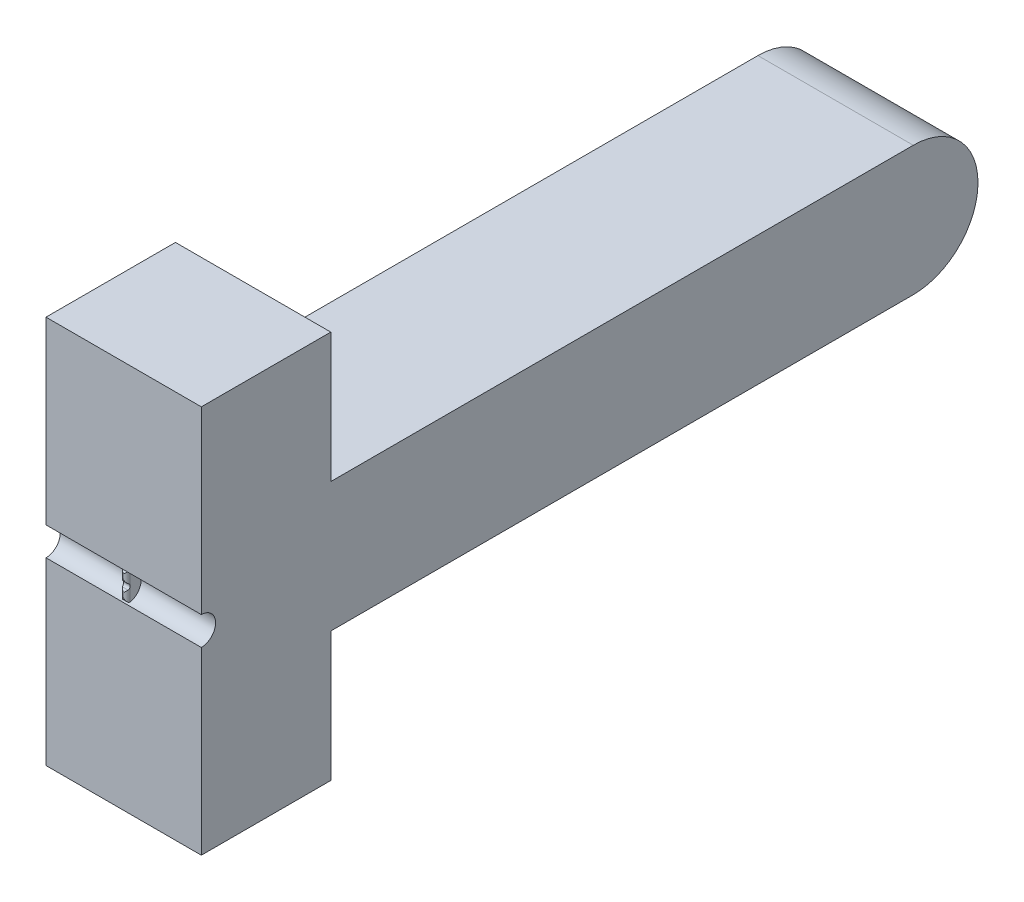
ISO-10303-21;
HEADER;
FILE_DESCRIPTION(('STEP AP214'),'2;1');
FILE_NAME('part.step','',(''),(''),'','','');
FILE_SCHEMA(('AUTOMOTIVE_DESIGN { 1 0 10303 214 1 1 1 1 }'));
ENDSEC;
DATA;
#1=APPLICATION_CONTEXT('core data for automotive mechanical design processes');
#2=APPLICATION_PROTOCOL_DEFINITION('international standard','automotive_design',2000,#1);
#3=PRODUCT_CONTEXT('',#1,'mechanical');
#4=PRODUCT('Part','Part','',(#3));
#5=PRODUCT_RELATED_PRODUCT_CATEGORY('part','',(#4));
#6=PRODUCT_DEFINITION_FORMATION('','',#4);
#7=PRODUCT_DEFINITION_CONTEXT('part definition',#1,'design');
#8=PRODUCT_DEFINITION('design','',#6,#7);
#9=PRODUCT_DEFINITION_SHAPE('','',#8);
#10=(LENGTH_UNIT() NAMED_UNIT(*) SI_UNIT(.MILLI.,.METRE.));
#11=(NAMED_UNIT(*) PLANE_ANGLE_UNIT() SI_UNIT($,.RADIAN.));
#12=(NAMED_UNIT(*) SI_UNIT($,.STERADIAN.) SOLID_ANGLE_UNIT());
#13=UNCERTAINTY_MEASURE_WITH_UNIT(LENGTH_MEASURE(1.E-05),#10,'distance_accuracy_value','');
#14=(GEOMETRIC_REPRESENTATION_CONTEXT(3) GLOBAL_UNCERTAINTY_ASSIGNED_CONTEXT((#13)) GLOBAL_UNIT_ASSIGNED_CONTEXT((#10,
#11,#12)) REPRESENTATION_CONTEXT('',''));
#15=CARTESIAN_POINT('',(0.,0.,0.));
#16=DIRECTION('',(0.,0.,1.));
#17=DIRECTION('',(1.,0.,0.));
#18=AXIS2_PLACEMENT_3D('',#15,#16,#17);
#19=CARTESIAN_POINT('',(-5.75,5.,60.));
#20=DIRECTION('',(-1.,0.,0.));
#21=DIRECTION('',(0.,0.,1.));
#22=AXIS2_PLACEMENT_3D('',#19,#20,#21);
#23=CYLINDRICAL_SURFACE('',#22,1.1);
#24=CARTESIAN_POINT('',(-6.25,5.,60.));
#25=DIRECTION('',(1.,0.,0.));
#26=DIRECTION('',(0.,0.,-1.));
#27=AXIS2_PLACEMENT_3D('',#24,#25,#26);
#28=CIRCLE('',#27,1.1);
#29=CARTESIAN_POINT('',(-6.25,3.94865385351771,59.6764705882353));
#30=VERTEX_POINT('',#29);
#31=CARTESIAN_POINT('',(-6.25,6.0513461464823,59.6764705882353));
#32=VERTEX_POINT('',#31);
#33=EDGE_CURVE('E144',#30,#32,#28,.T.);
#34=ORIENTED_EDGE('',*,*,#33,.T.);
#35=DIRECTION('',(-1.,0.,0.));
#36=VECTOR('',#35,1.);
#37=CARTESIAN_POINT('',(-5.75,6.0513461464823,59.6764705882353));
#38=LINE('',#37,#36);
#39=CARTESIAN_POINT('',(-5.75,6.0513461464823,59.6764705882353));
#40=VERTEX_POINT('',#39);
#41=EDGE_CURVE('E160',#32,#40,#38,.F.);
#42=ORIENTED_EDGE('',*,*,#41,.T.);
#43=CARTESIAN_POINT('',(-5.75,5.,60.));
#44=DIRECTION('',(1.,0.,0.));
#45=DIRECTION('',(0.,0.,-1.));
#46=AXIS2_PLACEMENT_3D('',#43,#44,#45);
#47=CIRCLE('',#46,1.1);
#48=CARTESIAN_POINT('',(-5.75,3.94865385351771,59.6764705882353));
#49=VERTEX_POINT('',#48);
#50=EDGE_CURVE('E281',#49,#40,#47,.T.);
#51=ORIENTED_EDGE('',*,*,#50,.F.);
#52=DIRECTION('',(-1.,0.,0.));
#53=VECTOR('',#52,1.);
#54=CARTESIAN_POINT('',(-5.75,3.94865385351771,59.6764705882353));
#55=LINE('',#54,#53);
#56=EDGE_CURVE('E163',#49,#30,#55,.T.);
#57=ORIENTED_EDGE('',*,*,#56,.T.);
#58=EDGE_LOOP('',(#34,#42,#51,#57));
#59=FACE_BOUND('',#58,.T.);
#60=ADVANCED_FACE('F73',(#59),#23,.T.);
#61=CARTESIAN_POINT('',(-5.75,0.,0.));
#62=DIRECTION('',(1.,0.,0.));
#63=DIRECTION('',(0.,0.,-1.));
#64=AXIS2_PLACEMENT_3D('',#61,#62,#63);
#65=PLANE('',#64);
#66=ORIENTED_EDGE('',*,*,#50,.T.);
#67=CARTESIAN_POINT('',(-5.75,5.8124038404636,59.75));
#68=DIRECTION('',(1.,0.,0.));
#69=DIRECTION('',(0.,0.,-1.));
#70=AXIS2_PLACEMENT_3D('',#67,#68,#69);
#71=CIRCLE('',#70,0.25);
#72=CARTESIAN_POINT('',(-5.75,6.0624038404636,59.75));
#73=VERTEX_POINT('',#72);
#74=EDGE_CURVE('E13',#40,#73,#71,.T.);
#75=ORIENTED_EDGE('',*,*,#74,.T.);
#76=DIRECTION('',(0.,1.,0.));
#77=VECTOR('',#76,1.);
#78=CARTESIAN_POINT('',(-5.75,0.,59.75));
#79=LINE('',#78,#77);
#80=CARTESIAN_POINT('',(-5.75,5.,59.75));
#81=VERTEX_POINT('',#80);
#82=EDGE_CURVE('E83',#73,#81,#79,.F.);
#83=ORIENTED_EDGE('',*,*,#82,.T.);
#84=DIRECTION('',(0.,1.,0.));
#85=VECTOR('',#84,1.);
#86=CARTESIAN_POINT('',(-5.75,0.,59.75));
#87=LINE('',#86,#85);
#88=CARTESIAN_POINT('',(-5.75,3.93759615953641,59.75));
#89=VERTEX_POINT('',#88);
#90=EDGE_CURVE('E157',#81,#89,#87,.F.);
#91=ORIENTED_EDGE('',*,*,#90,.T.);
#92=CARTESIAN_POINT('',(-5.75,4.18759615953641,59.75));
#93=DIRECTION('',(1.,0.,0.));
#94=DIRECTION('',(0.,0.,-1.));
#95=AXIS2_PLACEMENT_3D('',#92,#93,#94);
#96=CIRCLE('',#95,0.25);
#97=EDGE_CURVE('E131',#89,#49,#96,.T.);
#98=ORIENTED_EDGE('',*,*,#97,.T.);
#99=EDGE_LOOP('',(#66,#75,#83,#91,#98));
#100=FACE_BOUND('',#99,.T.);
#101=ADVANCED_FACE('F196',(#100),#65,.T.);
#102=CARTESIAN_POINT('',(-6.25,0.,0.));
#103=DIRECTION('',(1.,0.,0.));
#104=DIRECTION('',(0.,0.,-1.));
#105=AXIS2_PLACEMENT_3D('',#102,#103,#104);
#106=PLANE('',#105);
#107=DIRECTION('',(0.,1.,0.));
#108=VECTOR('',#107,1.);
#109=CARTESIAN_POINT('',(-6.25,6.1,59.75));
#110=LINE('',#109,#108);
#111=CARTESIAN_POINT('',(-6.25,5.00000000000002,59.75));
#112=VERTEX_POINT('',#111);
#113=CARTESIAN_POINT('',(-6.25,6.0624038404636,59.75));
#114=VERTEX_POINT('',#113);
#115=EDGE_CURVE('E241',#112,#114,#110,.T.);
#116=ORIENTED_EDGE('',*,*,#115,.T.);
#117=CARTESIAN_POINT('',(-6.25,5.8124038404636,59.75));
#118=DIRECTION('',(1.,0.,0.));
#119=DIRECTION('',(0.,0.,-1.));
#120=AXIS2_PLACEMENT_3D('',#117,#118,#119);
#121=CIRCLE('',#120,0.25);
#122=EDGE_CURVE('E245',#114,#32,#121,.F.);
#123=ORIENTED_EDGE('',*,*,#122,.T.);
#124=ORIENTED_EDGE('',*,*,#33,.F.);
#125=CARTESIAN_POINT('',(-6.25,4.18759615953641,59.75));
#126=DIRECTION('',(1.,0.,0.));
#127=DIRECTION('',(0.,0.,-1.));
#128=AXIS2_PLACEMENT_3D('',#125,#126,#127);
#129=CIRCLE('',#128,0.25);
#130=CARTESIAN_POINT('',(-6.25,3.93759615953641,59.75));
#131=VERTEX_POINT('',#130);
#132=EDGE_CURVE('E251',#30,#131,#129,.F.);
#133=ORIENTED_EDGE('',*,*,#132,.T.);
#134=DIRECTION('',(0.,1.,0.));
#135=VECTOR('',#134,1.);
#136=CARTESIAN_POINT('',(-6.25,4.75000000000001,59.75));
#137=LINE('',#136,#135);
#138=EDGE_CURVE('E123',#131,#112,#137,.T.);
#139=ORIENTED_EDGE('',*,*,#138,.T.);
#140=EDGE_LOOP('',(#116,#123,#124,#133,#139));
#141=FACE_BOUND('',#140,.T.);
#142=ADVANCED_FACE('F194',(#141),#106,.F.);
#143=CARTESIAN_POINT('',(-7.5,5.,60.));
#144=DIRECTION('',(1.,0.,0.));
#145=DIRECTION('',(0.,0.,-1.));
#146=AXIS2_PLACEMENT_3D('',#143,#144,#145);
#147=CYLINDRICAL_SURFACE('',#146,0.249999999999999);
#148=CARTESIAN_POINT('',(-5.75,5.,59.75));
#149=CARTESIAN_POINT('',(-5.75003262091622,5.0139208161661,59.7499881548247));
#150=CARTESIAN_POINT('',(-5.75000059464901,5.02783957599452,59.7511620395827));
#151=CARTESIAN_POINT('',(-5.75004787439646,5.0553126917845,59.755800745021));
#152=CARTESIAN_POINT('',(-5.75012735657008,5.06886643660339,59.7592691860213));
#153=CARTESIAN_POINT('',(-5.75063994361602,5.09521526033951,59.7684203253461));
#154=CARTESIAN_POINT('',(-5.75107338363627,5.10800960789387,59.774105119576));
#155=CARTESIAN_POINT('',(-5.75273677638882,5.13243403520452,59.7875036679508));
#156=CARTESIAN_POINT('',(-5.75396629464149,5.14406474604949,59.7952163139818));
#157=CARTESIAN_POINT('',(-5.7576679950602,5.16534580470878,59.8120173569789));
#158=CARTESIAN_POINT('',(-5.76009072594922,5.17505498318037,59.8210416701048));
#159=CARTESIAN_POINT('',(-5.76660933650815,5.19266531532618,59.8401637174042));
#160=CARTESIAN_POINT('',(-5.77069959021208,5.20057241045159,59.8502577585511));
#161=CARTESIAN_POINT('',(-5.77693849321583,5.20908746121073,59.8629196968004));
#162=CARTESIAN_POINT('',(-5.77817490029271,5.21064754505872,59.8653307431488));
#163=CARTESIAN_POINT('',(-5.78075400727634,5.21365812817178,59.8701608526376));
#164=CARTESIAN_POINT('',(-5.78209661317728,5.21510872218111,59.8725799069113));
#165=CARTESIAN_POINT('',(-5.78349364905385,5.21650635094615,59.875));
#166=B_SPLINE_CURVE_WITH_KNOTS('',3,(#148,#149,#150,#151,#152,#153,#154,#155,#156,#157,#158,
#159,#160,#161,#162,#163,#164,#165),.UNSPECIFIED.,.F.,.F.,(4,2,2,2,2,2,2,2,4),(0.,
0.0417106750383498,0.0834873180782013,0.125303563606979,0.167097006087943,0.207288081564695,
0.247344666141321,0.256722257962141,0.266091639809368),.UNSPECIFIED.);
#167=CARTESIAN_POINT('',(-5.78349364905388,5.21650635094611,59.875));
#168=VERTEX_POINT('',#167);
#169=EDGE_CURVE('E178',#81,#168,#166,.T.);
#170=ORIENTED_EDGE('',*,*,#169,.T.);
#171=DIRECTION('',(1.,0.,0.));
#172=VECTOR('',#171,1.);
#173=CARTESIAN_POINT('',(-7.5,5.21650635094611,59.875));
#174=LINE('',#173,#172);
#175=CARTESIAN_POINT('',(-6.21650635094612,5.21650635094611,59.875));
#176=VERTEX_POINT('',#175);
#177=EDGE_CURVE('E166',#168,#176,#174,.F.);
#178=ORIENTED_EDGE('',*,*,#177,.T.);
#179=CARTESIAN_POINT('',(-6.21650635094612,5.21650635094611,59.875));
#180=CARTESIAN_POINT('',(-6.22183863025229,5.21122297378364,59.8657910260841));
#181=CARTESIAN_POINT('',(-6.22633773244912,5.20511256980517,59.8566154521363));
#182=CARTESIAN_POINT('',(-6.23386917176981,5.19145177772991,59.8388574050552));
#183=CARTESIAN_POINT('',(-6.23691180069407,5.18391203540847,59.8302711489926));
#184=CARTESIAN_POINT('',(-6.24179566892079,5.16754006025118,59.8140865859026));
#185=CARTESIAN_POINT('',(-6.2436389550229,5.15871006108253,59.8064866135266));
#186=CARTESIAN_POINT('',(-6.24645825071775,5.13997723617137,59.7925322168194));
#187=CARTESIAN_POINT('',(-6.24743285798843,5.13007270459652,59.7861798193078));
#188=CARTESIAN_POINT('',(-6.24886445035048,5.1087781258285,59.774558449827));
#189=CARTESIAN_POINT('',(-6.24928418203001,5.09733352975473,59.7693852311052));
#190=CARTESIAN_POINT('',(-6.24980312020082,5.07379575881449,59.7608118669748));
#191=CARTESIAN_POINT('',(-6.2499024387425,5.06170281218444,59.7574111020774));
#192=CARTESIAN_POINT('',(-6.24998366624872,5.04129182414268,59.753293689577));
#193=CARTESIAN_POINT('',(-6.24999385874578,5.03307467793286,59.7520587469027));
#194=CARTESIAN_POINT('',(-6.25000003801893,5.01657255603858,59.7504122066096));
#195=CARTESIAN_POINT('',(-6.24999604914156,5.00828772094298,59.7499991997946));
#196=CARTESIAN_POINT('',(-6.25,5.00000000000002,59.75));
#197=B_SPLINE_CURVE_WITH_KNOTS('',3,(#179,#180,#181,#182,#183,#184,#185,#186,#187,#188,#189,
#190,#191,#192,#193,#194,#195,#196),.UNSPECIFIED.,.F.,.F.,(4,2,2,2,2,2,2,2,4),(0.,
0.0355431277176586,0.0708312492706482,0.106058989014931,0.141343494997623,0.178893545546424,
0.216430463192408,0.241320404899311,0.266167636296027),.UNSPECIFIED.);
#198=EDGE_CURVE('E169',#176,#112,#197,.T.);
#199=ORIENTED_EDGE('',*,*,#198,.T.);
#200=CARTESIAN_POINT('',(-6.25,5.00000000000002,59.75));
#201=CARTESIAN_POINT('',(-6.24996737908378,4.98607918383393,59.7499881548247));
#202=CARTESIAN_POINT('',(-6.24999940535099,4.97216042400551,59.7511620395827));
#203=CARTESIAN_POINT('',(-6.24995212560354,4.94468730821553,59.755800745021));
#204=CARTESIAN_POINT('',(-6.24987264342992,4.93113356339663,59.7592691860213));
#205=CARTESIAN_POINT('',(-6.24936005638398,4.90478473966051,59.7684203253461));
#206=CARTESIAN_POINT('',(-6.24892661636373,4.89199039210616,59.774105119576));
#207=CARTESIAN_POINT('',(-6.24726322361118,4.8675659647955,59.7875036679508));
#208=CARTESIAN_POINT('',(-6.24603370535851,4.85593525395053,59.7952163139818));
#209=CARTESIAN_POINT('',(-6.2423320049398,4.83465419529123,59.8120173569789));
#210=CARTESIAN_POINT('',(-6.23990927405078,4.82494501681964,59.8210416701048));
#211=CARTESIAN_POINT('',(-6.23339066349185,4.80733468467383,59.8401637174042));
#212=CARTESIAN_POINT('',(-6.22930040978793,4.79942758954842,59.8502577585511));
#213=CARTESIAN_POINT('',(-6.22306150678417,4.79091253878928,59.8629196968004));
#214=CARTESIAN_POINT('',(-6.2218250997073,4.78935245494129,59.8653307431488));
#215=CARTESIAN_POINT('',(-6.21924599272366,4.78634187182823,59.8701608526376));
#216=CARTESIAN_POINT('',(-6.21790338682273,4.7848912778189,59.8725799069113));
#217=CARTESIAN_POINT('',(-6.21650635094615,4.78349364905386,59.875));
#218=B_SPLINE_CURVE_WITH_KNOTS('',3,(#200,#201,#202,#203,#204,#205,#206,#207,#208,#209,#210,
#211,#212,#213,#214,#215,#216,#217),.UNSPECIFIED.,.F.,.F.,(4,2,2,2,2,2,2,2,4),(0.,
0.0417106750383501,0.0834873180782041,0.125303563606981,0.167097006087949,0.207288081564704,
0.24734466614133,0.256722257962157,0.266091639809386),.UNSPECIFIED.);
#219=CARTESIAN_POINT('',(-6.21650635094612,4.7834936490539,59.875));
#220=VERTEX_POINT('',#219);
#221=EDGE_CURVE('E201',#112,#220,#218,.T.);
#222=ORIENTED_EDGE('',*,*,#221,.T.);
#223=DIRECTION('',(1.,0.,0.));
#224=VECTOR('',#223,1.);
#225=CARTESIAN_POINT('',(-7.5,4.7834936490539,59.875));
#226=LINE('',#225,#224);
#227=CARTESIAN_POINT('',(-5.78349364905388,4.7834936490539,59.875));
#228=VERTEX_POINT('',#227);
#229=EDGE_CURVE('E253',#220,#228,#226,.T.);
#230=ORIENTED_EDGE('',*,*,#229,.T.);
#231=CARTESIAN_POINT('',(-5.78349364905388,4.7834936490539,59.875));
#232=CARTESIAN_POINT('',(-5.77816136974771,4.78877702621637,59.8657910260841));
#233=CARTESIAN_POINT('',(-5.77366226755088,4.79488743019484,59.8566154521363));
#234=CARTESIAN_POINT('',(-5.76613082823019,4.8085482222701,59.8388574050552));
#235=CARTESIAN_POINT('',(-5.76308819930593,4.81608796459154,59.8302711489926));
#236=CARTESIAN_POINT('',(-5.75820433107921,4.83245993974883,59.8140865859026));
#237=CARTESIAN_POINT('',(-5.7563610449771,4.84128993891748,59.8064866135266));
#238=CARTESIAN_POINT('',(-5.75354174928225,4.86002276382864,59.7925322168194));
#239=CARTESIAN_POINT('',(-5.75256714201157,4.86992729540349,59.7861798193078));
#240=CARTESIAN_POINT('',(-5.75113554964952,4.89122187417151,59.774558449827));
#241=CARTESIAN_POINT('',(-5.75071581796999,4.90266647024528,59.7693852311052));
#242=CARTESIAN_POINT('',(-5.75019687979918,4.92620424118552,59.7608118669748));
#243=CARTESIAN_POINT('',(-5.7500975612575,4.93829718781557,59.7574111020774));
#244=CARTESIAN_POINT('',(-5.75001633375128,4.95870817585733,59.753293689577));
#245=CARTESIAN_POINT('',(-5.75000614125422,4.96692532206716,59.7520587469027));
#246=CARTESIAN_POINT('',(-5.74999996198107,4.98342744396144,59.7504122066096));
#247=CARTESIAN_POINT('',(-5.75000395085844,4.99171227905704,59.7499991997946));
#248=CARTESIAN_POINT('',(-5.75,5.00000000000001,59.75));
#249=B_SPLINE_CURVE_WITH_KNOTS('',3,(#231,#232,#233,#234,#235,#236,#237,#238,#239,#240,#241,
#242,#243,#244,#245,#246,#247,#248),.UNSPECIFIED.,.F.,.F.,(4,2,2,2,2,2,2,2,4),(0.,
0.0355431277176586,0.0708312492706482,0.106058989014931,0.141343494997623,0.178893545546424,
0.216430463192408,0.241320404899322,0.266167636296046),.UNSPECIFIED.);
#250=EDGE_CURVE('E208',#228,#81,#249,.T.);
#251=ORIENTED_EDGE('',*,*,#250,.T.);
#252=EDGE_LOOP('',(#170,#178,#199,#222,#230,#251));
#253=FACE_BOUND('',#252,.T.);
#254=ADVANCED_FACE('F189',(#253),#147,.F.);
#255=CARTESIAN_POINT('',(-6.,0.,59.75));
#256=DIRECTION('',(0.,1.,0.));
#257=DIRECTION('',(0.,0.,1.));
#258=AXIS2_PLACEMENT_3D('',#255,#256,#257);
#259=CYLINDRICAL_SURFACE('',#258,0.25);
#260=CARTESIAN_POINT('',(-6.,5.43301270189222,59.75));
#261=DIRECTION('',(0.707106781186547,0.707106781186547,0.));
#262=DIRECTION('',(0.707106781186547,-0.707106781186547,0.));
#263=AXIS2_PLACEMENT_3D('',#260,#261,#262);
#264=ELLIPSE('',#263,0.353553390593274,0.25);
#265=CARTESIAN_POINT('',(-6.,5.43301270189222,60.));
#266=VERTEX_POINT('',#265);
#267=EDGE_CURVE('E142',#168,#266,#264,.F.);
#268=ORIENTED_EDGE('',*,*,#267,.F.);
#269=ORIENTED_EDGE('',*,*,#169,.F.);
#270=ORIENTED_EDGE('',*,*,#82,.F.);
#271=CARTESIAN_POINT('',(-6.,5.8124038404636,59.75));
#272=DIRECTION('',(-0.707106781186547,0.707106781186547,0.));
#273=DIRECTION('',(0.707106781186547,0.707106781186547,0.));
#274=AXIS2_PLACEMENT_3D('',#271,#272,#273);
#275=ELLIPSE('',#274,0.353553390593274,0.25);
#276=CARTESIAN_POINT('',(-6.,5.8124038404636,60.));
#277=VERTEX_POINT('',#276);
#278=EDGE_CURVE('E145',#277,#73,#275,.T.);
#279=ORIENTED_EDGE('',*,*,#278,.F.);
#280=DIRECTION('',(0.,1.,0.));
#281=VECTOR('',#280,1.);
#282=CARTESIAN_POINT('',(-6.,0.,60.));
#283=LINE('',#282,#281);
#284=EDGE_CURVE('E148',#266,#277,#283,.T.);
#285=ORIENTED_EDGE('',*,*,#284,.F.);
#286=EDGE_LOOP('',(#268,#269,#270,#279,#285));
#287=FACE_BOUND('',#286,.T.);
#288=ADVANCED_FACE('F193',(#287),#259,.T.);
#289=CARTESIAN_POINT('',(-7.5,5.43301270189222,59.75));
#290=DIRECTION('',(1.,0.,0.));
#291=DIRECTION('',(0.,0.,-1.));
#292=AXIS2_PLACEMENT_3D('',#289,#290,#291);
#293=CYLINDRICAL_SURFACE('',#292,0.25);
#294=ORIENTED_EDGE('',*,*,#177,.F.);
#295=ORIENTED_EDGE('',*,*,#267,.T.);
#296=CARTESIAN_POINT('',(-6.,5.43301270189222,59.75));
#297=DIRECTION('',(0.707106781186547,-0.707106781186547,0.));
#298=DIRECTION('',(0.707106781186547,0.707106781186547,0.));
#299=AXIS2_PLACEMENT_3D('',#296,#297,#298);
#300=ELLIPSE('',#299,0.353553390593274,0.25);
#301=EDGE_CURVE('E151',#176,#266,#300,.F.);
#302=ORIENTED_EDGE('',*,*,#301,.F.);
#303=EDGE_LOOP('',(#294,#295,#302));
#304=FACE_BOUND('',#303,.T.);
#305=ADVANCED_FACE('F275',(#304),#293,.T.);
#306=CARTESIAN_POINT('',(-5.75,5.8124038404636,59.75));
#307=DIRECTION('',(-1.,0.,0.));
#308=DIRECTION('',(0.,0.,1.));
#309=AXIS2_PLACEMENT_3D('',#306,#307,#308);
#310=CYLINDRICAL_SURFACE('',#309,0.25);
#311=ORIENTED_EDGE('',*,*,#41,.F.);
#312=ORIENTED_EDGE('',*,*,#122,.F.);
#313=CARTESIAN_POINT('',(-6.,5.8124038404636,59.75));
#314=DIRECTION('',(-0.707106781186547,-0.707106781186547,0.));
#315=DIRECTION('',(-0.707106781186547,0.707106781186547,0.));
#316=AXIS2_PLACEMENT_3D('',#313,#314,#315);
#317=ELLIPSE('',#316,0.353553390593274,0.25);
#318=EDGE_CURVE('E126',#277,#114,#317,.T.);
#319=ORIENTED_EDGE('',*,*,#318,.F.);
#320=ORIENTED_EDGE('',*,*,#278,.T.);
#321=ORIENTED_EDGE('',*,*,#74,.F.);
#322=EDGE_LOOP('',(#311,#312,#319,#320,#321));
#323=FACE_BOUND('',#322,.T.);
#324=ADVANCED_FACE('F284',(#323),#310,.T.);
#325=CARTESIAN_POINT('',(-6.,0.,59.75));
#326=DIRECTION('',(0.,-1.,0.));
#327=DIRECTION('',(0.,0.,-1.));
#328=AXIS2_PLACEMENT_3D('',#325,#326,#327);
#329=CYLINDRICAL_SURFACE('',#328,0.25);
#330=ORIENTED_EDGE('',*,*,#301,.T.);
#331=ORIENTED_EDGE('',*,*,#284,.T.);
#332=ORIENTED_EDGE('',*,*,#318,.T.);
#333=ORIENTED_EDGE('',*,*,#115,.F.);
#334=ORIENTED_EDGE('',*,*,#198,.F.);
#335=EDGE_LOOP('',(#330,#331,#332,#333,#334));
#336=FACE_BOUND('',#335,.T.);
#337=ADVANCED_FACE('F185',(#336),#329,.T.);
#338=CARTESIAN_POINT('',(-5.75,4.18759615953641,59.75));
#339=DIRECTION('',(-1.,0.,0.));
#340=DIRECTION('',(0.,0.,1.));
#341=AXIS2_PLACEMENT_3D('',#338,#339,#340);
#342=CYLINDRICAL_SURFACE('',#341,0.25);
#343=CARTESIAN_POINT('',(-6.,4.18759615953641,59.75));
#344=DIRECTION('',(0.707106781186547,-0.707106781186547,0.));
#345=DIRECTION('',(-0.707106781186547,-0.707106781186547,0.));
#346=AXIS2_PLACEMENT_3D('',#343,#344,#345);
#347=ELLIPSE('',#346,0.353553390593274,0.25);
#348=CARTESIAN_POINT('',(-6.,4.18759615953641,60.));
#349=VERTEX_POINT('',#348);
#350=EDGE_CURVE('E77',#131,#349,#347,.F.);
#351=ORIENTED_EDGE('',*,*,#350,.F.);
#352=ORIENTED_EDGE('',*,*,#132,.F.);
#353=ORIENTED_EDGE('',*,*,#56,.F.);
#354=ORIENTED_EDGE('',*,*,#97,.F.);
#355=CARTESIAN_POINT('',(-6.,4.18759615953641,59.75));
#356=DIRECTION('',(-0.707106781186547,-0.707106781186547,0.));
#357=DIRECTION('',(-0.707106781186547,0.707106781186547,0.));
#358=AXIS2_PLACEMENT_3D('',#355,#356,#357);
#359=ELLIPSE('',#358,0.353553390593274,0.25);
#360=EDGE_CURVE('E128',#349,#89,#359,.F.);
#361=ORIENTED_EDGE('',*,*,#360,.F.);
#362=EDGE_LOOP('',(#351,#352,#353,#354,#361));
#363=FACE_BOUND('',#362,.T.);
#364=ADVANCED_FACE('F75',(#363),#342,.T.);
#365=CARTESIAN_POINT('',(-6.,0.,59.75));
#366=DIRECTION('',(0.,-1.,0.));
#367=DIRECTION('',(0.,0.,-1.));
#368=AXIS2_PLACEMENT_3D('',#365,#366,#367);
#369=CYLINDRICAL_SURFACE('',#368,0.25);
#370=CARTESIAN_POINT('',(-6.,4.56698729810779,59.75));
#371=DIRECTION('',(0.707106781186547,0.707106781186547,0.));
#372=DIRECTION('',(0.707106781186547,-0.707106781186547,0.));
#373=AXIS2_PLACEMENT_3D('',#370,#371,#372);
#374=ELLIPSE('',#373,0.353553390593274,0.25);
#375=CARTESIAN_POINT('',(-6.,4.56698729810779,60.));
#376=VERTEX_POINT('',#375);
#377=EDGE_CURVE('E109',#220,#376,#374,.T.);
#378=ORIENTED_EDGE('',*,*,#377,.F.);
#379=ORIENTED_EDGE('',*,*,#221,.F.);
#380=ORIENTED_EDGE('',*,*,#138,.F.);
#381=ORIENTED_EDGE('',*,*,#350,.T.);
#382=DIRECTION('',(0.,1.,0.));
#383=VECTOR('',#382,1.);
#384=CARTESIAN_POINT('',(-6.,3.90000000000001,60.));
#385=LINE('',#384,#383);
#386=EDGE_CURVE('E118',#376,#349,#385,.F.);
#387=ORIENTED_EDGE('',*,*,#386,.F.);
#388=EDGE_LOOP('',(#378,#379,#380,#381,#387));
#389=FACE_BOUND('',#388,.T.);
#390=ADVANCED_FACE('F116',(#389),#369,.T.);
#391=CARTESIAN_POINT('',(-7.5,4.56698729810779,59.75));
#392=DIRECTION('',(1.,0.,0.));
#393=DIRECTION('',(0.,0.,-1.));
#394=AXIS2_PLACEMENT_3D('',#391,#392,#393);
#395=CYLINDRICAL_SURFACE('',#394,0.25);
#396=ORIENTED_EDGE('',*,*,#229,.F.);
#397=ORIENTED_EDGE('',*,*,#377,.T.);
#398=CARTESIAN_POINT('',(-6.,4.56698729810779,59.75));
#399=DIRECTION('',(0.707106781186547,-0.707106781186547,0.));
#400=DIRECTION('',(0.707106781186547,0.707106781186547,0.));
#401=AXIS2_PLACEMENT_3D('',#398,#399,#400);
#402=ELLIPSE('',#401,0.353553390593274,0.25);
#403=EDGE_CURVE('E138',#228,#376,#402,.T.);
#404=ORIENTED_EDGE('',*,*,#403,.F.);
#405=EDGE_LOOP('',(#396,#397,#404));
#406=FACE_BOUND('',#405,.T.);
#407=ADVANCED_FACE('F218',(#406),#395,.T.);
#408=CARTESIAN_POINT('',(-6.,0.,59.75));
#409=DIRECTION('',(0.,1.,0.));
#410=DIRECTION('',(0.,0.,1.));
#411=AXIS2_PLACEMENT_3D('',#408,#409,#410);
#412=CYLINDRICAL_SURFACE('',#411,0.25);
#413=ORIENTED_EDGE('',*,*,#360,.T.);
#414=ORIENTED_EDGE('',*,*,#90,.F.);
#415=ORIENTED_EDGE('',*,*,#250,.F.);
#416=ORIENTED_EDGE('',*,*,#403,.T.);
#417=ORIENTED_EDGE('',*,*,#386,.T.);
#418=EDGE_LOOP('',(#413,#414,#415,#416,#417));
#419=FACE_BOUND('',#418,.T.);
#420=ADVANCED_FACE('F136',(#419),#412,.T.);
#421=CLOSED_SHELL('',(#60,#101,#142,#254,#288,#305,#324,#337,#364,#390,#407,#420));
#422=MANIFOLD_SOLID_BREP('B2',#421);
#423=CARTESIAN_POINT('',(0.,0.,60.));
#424=DIRECTION('',(0.,0.,1.));
#425=DIRECTION('',(1.,0.,0.));
#426=AXIS2_PLACEMENT_3D('',#423,#424,#425);
#427=PLANE('',#426);
#428=DIRECTION('',(-1.,0.,0.));
#429=VECTOR('',#428,1.);
#430=CARTESIAN_POINT('',(0.,6.1,60.));
#431=LINE('',#430,#429);
#432=CARTESIAN_POINT('',(0.,6.1,60.));
#433=VERTEX_POINT('',#432);
#434=CARTESIAN_POINT('',(-12.,6.1,60.));
#435=VERTEX_POINT('',#434);
#436=EDGE_CURVE('E71',#433,#435,#431,.T.);
#437=ORIENTED_EDGE('',*,*,#436,.F.);
#438=DIRECTION('',(0.,1.,0.));
#439=VECTOR('',#438,1.);
#440=CARTESIAN_POINT('',(0.,0.,60.));
#441=LINE('',#440,#439);
#442=CARTESIAN_POINT('',(0.,20.,60.));
#443=VERTEX_POINT('',#442);
#444=EDGE_CURVE('E507',#433,#443,#441,.T.);
#445=ORIENTED_EDGE('',*,*,#444,.T.);
#446=DIRECTION('',(-1.,0.,0.));
#447=VECTOR('',#446,1.);
#448=CARTESIAN_POINT('',(0.,20.,60.));
#449=LINE('',#448,#447);
#450=CARTESIAN_POINT('',(-12.,20.,60.));
#451=VERTEX_POINT('',#450);
#452=EDGE_CURVE('E482',#443,#451,#449,.T.);
#453=ORIENTED_EDGE('',*,*,#452,.T.);
#454=DIRECTION('',(0.,-1.,0.));
#455=VECTOR('',#454,1.);
#456=CARTESIAN_POINT('',(-12.,0.,60.));
#457=LINE('',#456,#455);
#458=EDGE_CURVE('E476',#451,#435,#457,.T.);
#459=ORIENTED_EDGE('',*,*,#458,.T.);
#460=EDGE_LOOP('',(#437,#445,#453,#459));
#461=FACE_BOUND('',#460,.T.);
#462=ADVANCED_FACE('F391',(#461),#427,.T.);
#463=CARTESIAN_POINT('',(0.,0.,60.));
#464=DIRECTION('',(-1.,0.,0.));
#465=DIRECTION('',(0.,0.,1.));
#466=AXIS2_PLACEMENT_3D('',#463,#464,#465);
#467=PLANE('',#466);
#468=ORIENTED_EDGE('',*,*,#444,.F.);
#469=CARTESIAN_POINT('',(0.,5.,60.));
#470=DIRECTION('',(-1.,0.,0.));
#471=DIRECTION('',(0.,0.,1.));
#472=AXIS2_PLACEMENT_3D('',#469,#470,#471);
#473=CIRCLE('',#472,1.1);
#474=CARTESIAN_POINT('',(0.,3.90000000000001,60.));
#475=VERTEX_POINT('',#474);
#476=EDGE_CURVE('E468',#433,#475,#473,.T.);
#477=ORIENTED_EDGE('',*,*,#476,.T.);
#478=CARTESIAN_POINT('',(0.,-9.99999999999999,60.));
#479=VERTEX_POINT('',#478);
#480=EDGE_CURVE('E487',#479,#475,#441,.T.);
#481=ORIENTED_EDGE('',*,*,#480,.F.);
#482=DIRECTION('',(0.,0.,1.));
#483=VECTOR('',#482,1.);
#484=CARTESIAN_POINT('',(0.,-9.99999999999999,50.));
#485=LINE('',#484,#483);
#486=CARTESIAN_POINT('',(0.,-9.99999999999999,50.));
#487=VERTEX_POINT('',#486);
#488=EDGE_CURVE('E545',#487,#479,#485,.T.);
#489=ORIENTED_EDGE('',*,*,#488,.F.);
#490=DIRECTION('',(0.,-1.,0.));
#491=VECTOR('',#490,1.);
#492=CARTESIAN_POINT('',(0.,20.,50.));
#493=LINE('',#492,#491);
#494=CARTESIAN_POINT('',(0.,0.,50.));
#495=VERTEX_POINT('',#494);
#496=EDGE_CURVE('E538',#495,#487,#493,.T.);
#497=ORIENTED_EDGE('',*,*,#496,.F.);
#498=DIRECTION('',(0.,0.,-1.));
#499=VECTOR('',#498,1.);
#500=CARTESIAN_POINT('',(0.,0.,60.));
#501=LINE('',#500,#499);
#502=CARTESIAN_POINT('',(0.,0.,5.));
#503=VERTEX_POINT('',#502);
#504=EDGE_CURVE('E413',#495,#503,#501,.T.);
#505=ORIENTED_EDGE('',*,*,#504,.T.);
#506=CARTESIAN_POINT('',(0.,5.,5.));
#507=DIRECTION('',(-1.,0.,0.));
#508=DIRECTION('',(0.,0.,1.));
#509=AXIS2_PLACEMENT_3D('',#506,#507,#508);
#510=CIRCLE('',#509,5.);
#511=CARTESIAN_POINT('',(0.,10.,5.));
#512=VERTEX_POINT('',#511);
#513=EDGE_CURVE('E514',#512,#503,#510,.T.);
#514=ORIENTED_EDGE('',*,*,#513,.F.);
#515=DIRECTION('',(0.,0.,-1.));
#516=VECTOR('',#515,1.);
#517=CARTESIAN_POINT('',(0.,10.,60.));
#518=LINE('',#517,#516);
#519=CARTESIAN_POINT('',(0.,10.,50.));
#520=VERTEX_POINT('',#519);
#521=EDGE_CURVE('E494',#520,#512,#518,.T.);
#522=ORIENTED_EDGE('',*,*,#521,.F.);
#523=CARTESIAN_POINT('',(0.,20.,50.));
#524=VERTEX_POINT('',#523);
#525=EDGE_CURVE('E547',#524,#520,#493,.T.);
#526=ORIENTED_EDGE('',*,*,#525,.F.);
#527=DIRECTION('',(0.,0.,-1.));
#528=VECTOR('',#527,1.);
#529=CARTESIAN_POINT('',(0.,20.,60.));
#530=LINE('',#529,#528);
#531=EDGE_CURVE('E532',#443,#524,#530,.T.);
#532=ORIENTED_EDGE('',*,*,#531,.F.);
#533=EDGE_LOOP('',(#468,#477,#481,#489,#497,#505,#514,#522,#526,#532));
#534=FACE_BOUND('',#533,.T.);
#535=ADVANCED_FACE('F393',(#534),#467,.F.);
#536=CARTESIAN_POINT('',(-12.,0.,60.));
#537=DIRECTION('',(1.,0.,0.));
#538=DIRECTION('',(0.,0.,-1.));
#539=AXIS2_PLACEMENT_3D('',#536,#537,#538);
#540=PLANE('',#539);
#541=CARTESIAN_POINT('',(-12.,3.90000000000001,60.));
#542=VERTEX_POINT('',#541);
#543=CARTESIAN_POINT('',(-12.,-9.99999999999999,60.));
#544=VERTEX_POINT('',#543);
#545=EDGE_CURVE('E479',#542,#544,#457,.T.);
#546=ORIENTED_EDGE('',*,*,#545,.F.);
#547=CARTESIAN_POINT('',(-12.,5.,60.));
#548=DIRECTION('',(-1.,0.,0.));
#549=DIRECTION('',(0.,0.,1.));
#550=AXIS2_PLACEMENT_3D('',#547,#548,#549);
#551=CIRCLE('',#550,1.1);
#552=EDGE_CURVE('E405',#435,#542,#551,.T.);
#553=ORIENTED_EDGE('',*,*,#552,.F.);
#554=ORIENTED_EDGE('',*,*,#458,.F.);
#555=DIRECTION('',(0.,0.,-1.));
#556=VECTOR('',#555,1.);
#557=CARTESIAN_POINT('',(-12.,20.,60.));
#558=LINE('',#557,#556);
#559=CARTESIAN_POINT('',(-12.,20.,50.));
#560=VERTEX_POINT('',#559);
#561=EDGE_CURVE('E536',#451,#560,#558,.T.);
#562=ORIENTED_EDGE('',*,*,#561,.T.);
#563=DIRECTION('',(0.,-1.,0.));
#564=VECTOR('',#563,1.);
#565=CARTESIAN_POINT('',(-12.,20.,50.));
#566=LINE('',#565,#564);
#567=CARTESIAN_POINT('',(-12.,10.,50.));
#568=VERTEX_POINT('',#567);
#569=EDGE_CURVE('E541',#560,#568,#566,.T.);
#570=ORIENTED_EDGE('',*,*,#569,.T.);
#571=DIRECTION('',(0.,0.,-1.));
#572=VECTOR('',#571,1.);
#573=CARTESIAN_POINT('',(-12.,10.,60.));
#574=LINE('',#573,#572);
#575=CARTESIAN_POINT('',(-12.,10.,5.));
#576=VERTEX_POINT('',#575);
#577=EDGE_CURVE('E492',#568,#576,#574,.T.);
#578=ORIENTED_EDGE('',*,*,#577,.T.);
#579=CARTESIAN_POINT('',(-12.,5.,5.));
#580=DIRECTION('',(-1.,0.,0.));
#581=DIRECTION('',(0.,0.,1.));
#582=AXIS2_PLACEMENT_3D('',#579,#580,#581);
#583=CIRCLE('',#582,5.);
#584=CARTESIAN_POINT('',(-12.,0.,5.));
#585=VERTEX_POINT('',#584);
#586=EDGE_CURVE('E521',#576,#585,#583,.T.);
#587=ORIENTED_EDGE('',*,*,#586,.T.);
#588=DIRECTION('',(0.,0.,-1.));
#589=VECTOR('',#588,1.);
#590=CARTESIAN_POINT('',(-12.,0.,60.));
#591=LINE('',#590,#589);
#592=CARTESIAN_POINT('',(-12.,0.,50.));
#593=VERTEX_POINT('',#592);
#594=EDGE_CURVE('E485',#593,#585,#591,.T.);
#595=ORIENTED_EDGE('',*,*,#594,.F.);
#596=CARTESIAN_POINT('',(-12.,-9.99999999999999,50.));
#597=VERTEX_POINT('',#596);
#598=EDGE_CURVE('E508',#593,#597,#566,.T.);
#599=ORIENTED_EDGE('',*,*,#598,.T.);
#600=DIRECTION('',(0.,0.,1.));
#601=VECTOR('',#600,1.);
#602=CARTESIAN_POINT('',(-12.,-9.99999999999999,50.));
#603=LINE('',#602,#601);
#604=EDGE_CURVE('E539',#597,#544,#603,.T.);
#605=ORIENTED_EDGE('',*,*,#604,.T.);
#606=EDGE_LOOP('',(#546,#553,#554,#562,#570,#578,#587,#595,#599,#605));
#607=FACE_BOUND('',#606,.T.);
#608=ADVANCED_FACE('F474',(#607),#540,.F.);
#609=CARTESIAN_POINT('',(0.,0.,60.));
#610=DIRECTION('',(0.,1.,0.));
#611=DIRECTION('',(0.,0.,1.));
#612=AXIS2_PLACEMENT_3D('',#609,#610,#611);
#613=PLANE('',#612);
#614=ORIENTED_EDGE('',*,*,#504,.F.);
#615=DIRECTION('',(-1.,0.,0.));
#616=VECTOR('',#615,1.);
#617=CARTESIAN_POINT('',(0.,0.,50.));
#618=LINE('',#617,#616);
#619=EDGE_CURVE('E526',#495,#593,#618,.T.);
#620=ORIENTED_EDGE('',*,*,#619,.T.);
#621=ORIENTED_EDGE('',*,*,#594,.T.);
#622=DIRECTION('',(-1.,0.,0.));
#623=VECTOR('',#622,1.);
#624=CARTESIAN_POINT('',(48.,0.,5.));
#625=LINE('',#624,#623);
#626=EDGE_CURVE('E496',#503,#585,#625,.T.);
#627=ORIENTED_EDGE('',*,*,#626,.F.);
#628=EDGE_LOOP('',(#614,#620,#621,#627));
#629=FACE_BOUND('',#628,.T.);
#630=ADVANCED_FACE('F560',(#629),#613,.F.);
#631=CARTESIAN_POINT('',(0.,10.,60.));
#632=DIRECTION('',(0.,-1.,0.));
#633=DIRECTION('',(0.,0.,-1.));
#634=AXIS2_PLACEMENT_3D('',#631,#632,#633);
#635=PLANE('',#634);
#636=ORIENTED_EDGE('',*,*,#577,.F.);
#637=DIRECTION('',(1.,0.,0.));
#638=VECTOR('',#637,1.);
#639=CARTESIAN_POINT('',(0.,10.,50.));
#640=LINE('',#639,#638);
#641=EDGE_CURVE('E499',#568,#520,#640,.T.);
#642=ORIENTED_EDGE('',*,*,#641,.T.);
#643=ORIENTED_EDGE('',*,*,#521,.T.);
#644=DIRECTION('',(-1.,0.,0.));
#645=VECTOR('',#644,1.);
#646=CARTESIAN_POINT('',(48.,10.,5.));
#647=LINE('',#646,#645);
#648=EDGE_CURVE('E516',#512,#576,#647,.T.);
#649=ORIENTED_EDGE('',*,*,#648,.T.);
#650=EDGE_LOOP('',(#636,#642,#643,#649));
#651=FACE_BOUND('',#650,.T.);
#652=ADVANCED_FACE('F562',(#651),#635,.F.);
#653=DIRECTION('',(-1.,0.,0.));
#654=VECTOR('',#653,1.);
#655=CARTESIAN_POINT('',(0.,3.90000000000001,60.));
#656=LINE('',#655,#654);
#657=EDGE_CURVE('E399',#542,#475,#656,.F.);
#658=ORIENTED_EDGE('',*,*,#657,.F.);
#659=ORIENTED_EDGE('',*,*,#545,.T.);
#660=DIRECTION('',(-1.,0.,0.));
#661=VECTOR('',#660,1.);
#662=CARTESIAN_POINT('',(0.,-9.99999999999999,60.));
#663=LINE('',#662,#661);
#664=EDGE_CURVE('E512',#479,#544,#663,.T.);
#665=ORIENTED_EDGE('',*,*,#664,.F.);
#666=ORIENTED_EDGE('',*,*,#480,.T.);
#667=EDGE_LOOP('',(#658,#659,#665,#666));
#668=FACE_BOUND('',#667,.T.);
#669=ADVANCED_FACE('F510',(#668),#427,.T.);
#670=CARTESIAN_POINT('',(48.,5.,5.));
#671=DIRECTION('',(-1.,0.,0.));
#672=DIRECTION('',(0.,0.,1.));
#673=AXIS2_PLACEMENT_3D('',#670,#671,#672);
#674=CYLINDRICAL_SURFACE('',#673,5.);
#675=ORIENTED_EDGE('',*,*,#513,.T.);
#676=ORIENTED_EDGE('',*,*,#626,.T.);
#677=ORIENTED_EDGE('',*,*,#586,.F.);
#678=ORIENTED_EDGE('',*,*,#648,.F.);
#679=EDGE_LOOP('',(#675,#676,#677,#678));
#680=FACE_BOUND('',#679,.T.);
#681=ADVANCED_FACE('F577',(#680),#674,.T.);
#682=CARTESIAN_POINT('',(0.,20.,60.));
#683=DIRECTION('',(0.,1.,0.));
#684=DIRECTION('',(0.,0.,1.));
#685=AXIS2_PLACEMENT_3D('',#682,#683,#684);
#686=PLANE('',#685);
#687=ORIENTED_EDGE('',*,*,#561,.F.);
#688=ORIENTED_EDGE('',*,*,#452,.F.);
#689=ORIENTED_EDGE('',*,*,#531,.T.);
#690=DIRECTION('',(-1.,0.,0.));
#691=VECTOR('',#690,1.);
#692=CARTESIAN_POINT('',(0.,20.,50.));
#693=LINE('',#692,#691);
#694=EDGE_CURVE('E528',#524,#560,#693,.T.);
#695=ORIENTED_EDGE('',*,*,#694,.T.);
#696=EDGE_LOOP('',(#687,#688,#689,#695));
#697=FACE_BOUND('',#696,.T.);
#698=ADVANCED_FACE('F581',(#697),#686,.T.);
#699=CARTESIAN_POINT('',(0.,20.,50.));
#700=DIRECTION('',(0.,0.,-1.));
#701=DIRECTION('',(-1.,0.,0.));
#702=AXIS2_PLACEMENT_3D('',#699,#700,#701);
#703=PLANE('',#702);
#704=ORIENTED_EDGE('',*,*,#641,.F.);
#705=ORIENTED_EDGE('',*,*,#569,.F.);
#706=ORIENTED_EDGE('',*,*,#694,.F.);
#707=ORIENTED_EDGE('',*,*,#525,.T.);
#708=EDGE_LOOP('',(#704,#705,#706,#707));
#709=FACE_BOUND('',#708,.T.);
#710=ADVANCED_FACE('F585',(#709),#703,.T.);
#711=ORIENTED_EDGE('',*,*,#619,.F.);
#712=ORIENTED_EDGE('',*,*,#496,.T.);
#713=DIRECTION('',(-1.,0.,0.));
#714=VECTOR('',#713,1.);
#715=CARTESIAN_POINT('',(0.,-9.99999999999999,50.));
#716=LINE('',#715,#714);
#717=EDGE_CURVE('E529',#487,#597,#716,.T.);
#718=ORIENTED_EDGE('',*,*,#717,.T.);
#719=ORIENTED_EDGE('',*,*,#598,.F.);
#720=EDGE_LOOP('',(#711,#712,#718,#719));
#721=FACE_BOUND('',#720,.T.);
#722=ADVANCED_FACE('F554',(#721),#703,.T.);
#723=CARTESIAN_POINT('',(0.,-9.99999999999999,50.));
#724=DIRECTION('',(0.,-1.,0.));
#725=DIRECTION('',(0.,0.,-1.));
#726=AXIS2_PLACEMENT_3D('',#723,#724,#725);
#727=PLANE('',#726);
#728=ORIENTED_EDGE('',*,*,#604,.F.);
#729=ORIENTED_EDGE('',*,*,#717,.F.);
#730=ORIENTED_EDGE('',*,*,#488,.T.);
#731=ORIENTED_EDGE('',*,*,#664,.T.);
#732=EDGE_LOOP('',(#728,#729,#730,#731));
#733=FACE_BOUND('',#732,.T.);
#734=ADVANCED_FACE('F558',(#733),#727,.T.);
#735=CARTESIAN_POINT('',(0.,5.,60.));
#736=DIRECTION('',(-1.,0.,0.));
#737=DIRECTION('',(0.,0.,1.));
#738=AXIS2_PLACEMENT_3D('',#735,#736,#737);
#739=CYLINDRICAL_SURFACE('',#738,1.1);
#740=ORIENTED_EDGE('',*,*,#436,.T.);
#741=ORIENTED_EDGE('',*,*,#552,.T.);
#742=ORIENTED_EDGE('',*,*,#657,.T.);
#743=ORIENTED_EDGE('',*,*,#476,.F.);
#744=EDGE_LOOP('',(#740,#741,#742,#743));
#745=FACE_BOUND('',#744,.T.);
#746=ADVANCED_FACE('F466',(#745),#739,.F.);
#747=CLOSED_SHELL('',(#462,#535,#608,#630,#652,#669,#681,#698,#710,#722,#734,#746));
#748=MANIFOLD_SOLID_BREP('B7',#747);
#749=ADVANCED_BREP_SHAPE_REPRESENTATION('',(#18,#422,#748),#14);
#750=SHAPE_DEFINITION_REPRESENTATION(#9,#749);
ENDSEC;
END-ISO-10303-21;
